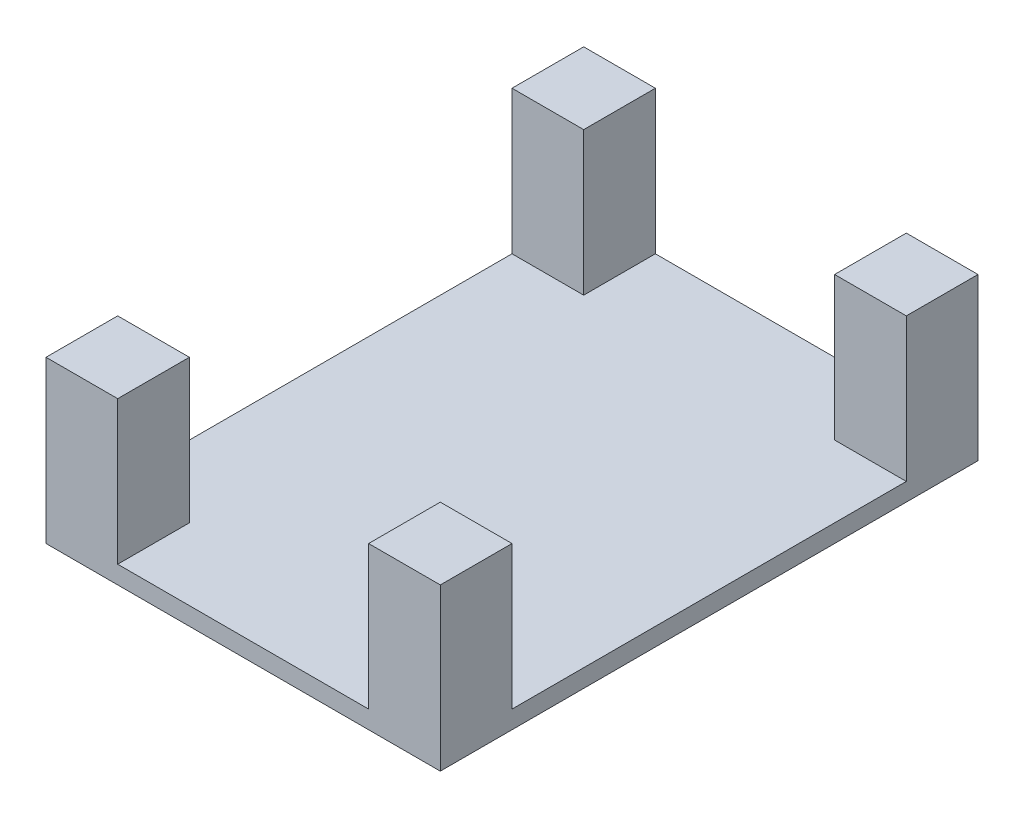
ISO-10303-21;
HEADER;
FILE_DESCRIPTION(('STEP AP214'),'2;1');
FILE_NAME('part.step','',(''),(''),'','','');
FILE_SCHEMA(('AUTOMOTIVE_DESIGN { 1 0 10303 214 1 1 1 1 }'));
ENDSEC;
DATA;
#1=APPLICATION_CONTEXT('core data for automotive mechanical design processes');
#2=APPLICATION_PROTOCOL_DEFINITION('international standard','automotive_design',2000,#1);
#3=PRODUCT_CONTEXT('',#1,'mechanical');
#4=PRODUCT('Part','Part','',(#3));
#5=PRODUCT_RELATED_PRODUCT_CATEGORY('part','',(#4));
#6=PRODUCT_DEFINITION_FORMATION('','',#4);
#7=PRODUCT_DEFINITION_CONTEXT('part definition',#1,'design');
#8=PRODUCT_DEFINITION('design','',#6,#7);
#9=PRODUCT_DEFINITION_SHAPE('','',#8);
#10=(LENGTH_UNIT() NAMED_UNIT(*) SI_UNIT(.MILLI.,.METRE.));
#11=(NAMED_UNIT(*) PLANE_ANGLE_UNIT() SI_UNIT($,.RADIAN.));
#12=(NAMED_UNIT(*) SI_UNIT($,.STERADIAN.) SOLID_ANGLE_UNIT());
#13=UNCERTAINTY_MEASURE_WITH_UNIT(LENGTH_MEASURE(1.E-05),#10,'distance_accuracy_value','');
#14=(GEOMETRIC_REPRESENTATION_CONTEXT(3) GLOBAL_UNCERTAINTY_ASSIGNED_CONTEXT((#13)) GLOBAL_UNIT_ASSIGNED_CONTEXT((#10,
#11,#12)) REPRESENTATION_CONTEXT('',''));
#15=CARTESIAN_POINT('',(0.,0.,0.));
#16=DIRECTION('',(0.,0.,1.));
#17=DIRECTION('',(1.,0.,0.));
#18=AXIS2_PLACEMENT_3D('',#15,#16,#17);
#19=CARTESIAN_POINT('',(0.,5.,0.));
#20=DIRECTION('',(0.,-1.,0.));
#21=DIRECTION('',(0.,0.,-1.));
#22=AXIS2_PLACEMENT_3D('',#19,#20,#21);
#23=PLANE('',#22);
#24=DIRECTION('',(0.,0.,1.));
#25=VECTOR('',#24,1.);
#26=CARTESIAN_POINT('',(90.,5.,-150.));
#27=LINE('',#26,#25);
#28=CARTESIAN_POINT('',(90.,5.,-150.));
#29=VERTEX_POINT('',#28);
#30=CARTESIAN_POINT('',(90.,5.,-130.));
#31=VERTEX_POINT('',#30);
#32=EDGE_CURVE('E162',#29,#31,#27,.T.);
#33=ORIENTED_EDGE('',*,*,#32,.F.);
#34=DIRECTION('',(-1.,0.,0.));
#35=VECTOR('',#34,1.);
#36=CARTESIAN_POINT('',(0.,5.,-150.));
#37=LINE('',#36,#35);
#38=CARTESIAN_POINT('',(20.,5.,-150.));
#39=VERTEX_POINT('',#38);
#40=EDGE_CURVE('E151',#29,#39,#37,.T.);
#41=ORIENTED_EDGE('',*,*,#40,.T.);
#42=DIRECTION('',(0.,0.,-1.));
#43=VECTOR('',#42,1.);
#44=CARTESIAN_POINT('',(20.,5.,-150.));
#45=LINE('',#44,#43);
#46=CARTESIAN_POINT('',(20.,5.,-130.));
#47=VERTEX_POINT('',#46);
#48=EDGE_CURVE('E241',#47,#39,#45,.T.);
#49=ORIENTED_EDGE('',*,*,#48,.F.);
#50=DIRECTION('',(1.,0.,0.));
#51=VECTOR('',#50,1.);
#52=CARTESIAN_POINT('',(0.,5.,-130.));
#53=LINE('',#52,#51);
#54=CARTESIAN_POINT('',(0.,5.,-130.));
#55=VERTEX_POINT('',#54);
#56=EDGE_CURVE('E228',#55,#47,#53,.T.);
#57=ORIENTED_EDGE('',*,*,#56,.F.);
#58=DIRECTION('',(0.,0.,1.));
#59=VECTOR('',#58,1.);
#60=CARTESIAN_POINT('',(0.,5.,0.));
#61=LINE('',#60,#59);
#62=CARTESIAN_POINT('',(0.,5.,-20.));
#63=VERTEX_POINT('',#62);
#64=EDGE_CURVE('E259',#55,#63,#61,.T.);
#65=ORIENTED_EDGE('',*,*,#64,.T.);
#66=DIRECTION('',(-1.,0.,0.));
#67=VECTOR('',#66,1.);
#68=CARTESIAN_POINT('',(0.,5.,-20.));
#69=LINE('',#68,#67);
#70=CARTESIAN_POINT('',(20.,5.,-20.));
#71=VERTEX_POINT('',#70);
#72=EDGE_CURVE('E221',#71,#63,#69,.T.);
#73=ORIENTED_EDGE('',*,*,#72,.F.);
#74=DIRECTION('',(0.,0.,-1.));
#75=VECTOR('',#74,1.);
#76=CARTESIAN_POINT('',(20.,5.,0.));
#77=LINE('',#76,#75);
#78=CARTESIAN_POINT('',(20.,5.,0.));
#79=VERTEX_POINT('',#78);
#80=EDGE_CURVE('E224',#79,#71,#77,.T.);
#81=ORIENTED_EDGE('',*,*,#80,.F.);
#82=DIRECTION('',(1.,0.,0.));
#83=VECTOR('',#82,1.);
#84=CARTESIAN_POINT('',(0.,5.,0.));
#85=LINE('',#84,#83);
#86=CARTESIAN_POINT('',(90.,5.,0.));
#87=VERTEX_POINT('',#86);
#88=EDGE_CURVE('E261',#79,#87,#85,.T.);
#89=ORIENTED_EDGE('',*,*,#88,.T.);
#90=DIRECTION('',(0.,0.,1.));
#91=VECTOR('',#90,1.);
#92=CARTESIAN_POINT('',(90.,5.,0.));
#93=LINE('',#92,#91);
#94=CARTESIAN_POINT('',(90.,5.,-20.));
#95=VERTEX_POINT('',#94);
#96=EDGE_CURVE('E196',#95,#87,#93,.T.);
#97=ORIENTED_EDGE('',*,*,#96,.F.);
#98=DIRECTION('',(-1.,0.,0.));
#99=VECTOR('',#98,1.);
#100=CARTESIAN_POINT('',(110.,5.,-20.));
#101=LINE('',#100,#99);
#102=CARTESIAN_POINT('',(110.,5.,-20.));
#103=VERTEX_POINT('',#102);
#104=EDGE_CURVE('E199',#103,#95,#101,.T.);
#105=ORIENTED_EDGE('',*,*,#104,.F.);
#106=DIRECTION('',(0.,0.,-1.));
#107=VECTOR('',#106,1.);
#108=CARTESIAN_POINT('',(110.,5.,0.));
#109=LINE('',#108,#107);
#110=CARTESIAN_POINT('',(110.,5.,-130.));
#111=VERTEX_POINT('',#110);
#112=EDGE_CURVE('E59',#103,#111,#109,.T.);
#113=ORIENTED_EDGE('',*,*,#112,.T.);
#114=DIRECTION('',(1.,0.,0.));
#115=VECTOR('',#114,1.);
#116=CARTESIAN_POINT('',(110.,5.,-130.));
#117=LINE('',#116,#115);
#118=EDGE_CURVE('E54',#31,#111,#117,.T.);
#119=ORIENTED_EDGE('',*,*,#118,.F.);
#120=EDGE_LOOP('',(#33,#41,#49,#57,#65,#73,#81,#89,#97,#105,#113,#119));
#121=FACE_BOUND('',#120,.T.);
#122=ADVANCED_FACE('F39',(#121),#23,.F.);
#123=CARTESIAN_POINT('',(0.,5.,0.));
#124=DIRECTION('',(1.,0.,0.));
#125=DIRECTION('',(0.,0.,-1.));
#126=AXIS2_PLACEMENT_3D('',#123,#124,#125);
#127=PLANE('',#126);
#128=DIRECTION('',(0.,0.,1.));
#129=VECTOR('',#128,1.);
#130=CARTESIAN_POINT('',(0.,0.,0.));
#131=LINE('',#130,#129);
#132=CARTESIAN_POINT('',(0.,0.,-150.));
#133=VERTEX_POINT('',#132);
#134=CARTESIAN_POINT('',(0.,0.,0.));
#135=VERTEX_POINT('',#134);
#136=EDGE_CURVE('E258',#133,#135,#131,.T.);
#137=ORIENTED_EDGE('',*,*,#136,.T.);
#138=DIRECTION('',(0.,-1.,0.));
#139=VECTOR('',#138,1.);
#140=CARTESIAN_POINT('',(0.,5.,0.));
#141=LINE('',#140,#139);
#142=CARTESIAN_POINT('',(0.,45.,0.));
#143=VERTEX_POINT('',#142);
#144=EDGE_CURVE('E11',#143,#135,#141,.T.);
#145=ORIENTED_EDGE('',*,*,#144,.F.);
#146=DIRECTION('',(0.,0.,1.));
#147=VECTOR('',#146,1.);
#148=CARTESIAN_POINT('',(0.,45.,0.));
#149=LINE('',#148,#147);
#150=CARTESIAN_POINT('',(0.,45.,-20.));
#151=VERTEX_POINT('',#150);
#152=EDGE_CURVE('E220',#151,#143,#149,.T.);
#153=ORIENTED_EDGE('',*,*,#152,.F.);
#154=DIRECTION('',(0.,-1.,0.));
#155=VECTOR('',#154,1.);
#156=CARTESIAN_POINT('',(0.,45.,-20.));
#157=LINE('',#156,#155);
#158=EDGE_CURVE('E217',#151,#63,#157,.T.);
#159=ORIENTED_EDGE('',*,*,#158,.T.);
#160=ORIENTED_EDGE('',*,*,#64,.F.);
#161=DIRECTION('',(0.,-1.,0.));
#162=VECTOR('',#161,1.);
#163=CARTESIAN_POINT('',(0.,45.,-130.));
#164=LINE('',#163,#162);
#165=CARTESIAN_POINT('',(0.,45.,-130.));
#166=VERTEX_POINT('',#165);
#167=EDGE_CURVE('E255',#166,#55,#164,.T.);
#168=ORIENTED_EDGE('',*,*,#167,.F.);
#169=DIRECTION('',(0.,0.,1.));
#170=VECTOR('',#169,1.);
#171=CARTESIAN_POINT('',(0.,45.,-150.));
#172=LINE('',#171,#170);
#173=CARTESIAN_POINT('',(0.,45.,-150.));
#174=VERTEX_POINT('',#173);
#175=EDGE_CURVE('E237',#174,#166,#172,.T.);
#176=ORIENTED_EDGE('',*,*,#175,.F.);
#177=DIRECTION('',(0.,-1.,0.));
#178=VECTOR('',#177,1.);
#179=CARTESIAN_POINT('',(0.,5.,-150.));
#180=LINE('',#179,#178);
#181=EDGE_CURVE('E160',#174,#133,#180,.T.);
#182=ORIENTED_EDGE('',*,*,#181,.T.);
#183=EDGE_LOOP('',(#137,#145,#153,#159,#160,#168,#176,#182));
#184=FACE_BOUND('',#183,.T.);
#185=ADVANCED_FACE('F41',(#184),#127,.F.);
#186=CARTESIAN_POINT('',(0.,5.,0.));
#187=DIRECTION('',(0.,0.,-1.));
#188=DIRECTION('',(-1.,0.,0.));
#189=AXIS2_PLACEMENT_3D('',#186,#187,#188);
#190=PLANE('',#189);
#191=DIRECTION('',(1.,0.,0.));
#192=VECTOR('',#191,1.);
#193=CARTESIAN_POINT('',(0.,0.,0.));
#194=LINE('',#193,#192);
#195=CARTESIAN_POINT('',(110.,0.,0.));
#196=VERTEX_POINT('',#195);
#197=EDGE_CURVE('E267',#135,#196,#194,.T.);
#198=ORIENTED_EDGE('',*,*,#197,.T.);
#199=DIRECTION('',(0.,-1.,0.));
#200=VECTOR('',#199,1.);
#201=CARTESIAN_POINT('',(110.,5.,0.));
#202=LINE('',#201,#200);
#203=CARTESIAN_POINT('',(110.,45.,0.));
#204=VERTEX_POINT('',#203);
#205=EDGE_CURVE('E47',#204,#196,#202,.T.);
#206=ORIENTED_EDGE('',*,*,#205,.F.);
#207=DIRECTION('',(1.,0.,0.));
#208=VECTOR('',#207,1.);
#209=CARTESIAN_POINT('',(110.,45.,0.));
#210=LINE('',#209,#208);
#211=CARTESIAN_POINT('',(90.,45.,0.));
#212=VERTEX_POINT('',#211);
#213=EDGE_CURVE('E195',#212,#204,#210,.T.);
#214=ORIENTED_EDGE('',*,*,#213,.F.);
#215=DIRECTION('',(0.,-1.,0.));
#216=VECTOR('',#215,1.);
#217=CARTESIAN_POINT('',(90.,45.,0.));
#218=LINE('',#217,#216);
#219=EDGE_CURVE('E192',#212,#87,#218,.T.);
#220=ORIENTED_EDGE('',*,*,#219,.T.);
#221=ORIENTED_EDGE('',*,*,#88,.F.);
#222=DIRECTION('',(0.,-1.,0.));
#223=VECTOR('',#222,1.);
#224=CARTESIAN_POINT('',(20.,45.,0.));
#225=LINE('',#224,#223);
#226=CARTESIAN_POINT('',(20.,45.,0.));
#227=VERTEX_POINT('',#226);
#228=EDGE_CURVE('E203',#227,#79,#225,.T.);
#229=ORIENTED_EDGE('',*,*,#228,.F.);
#230=DIRECTION('',(1.,0.,0.));
#231=VECTOR('',#230,1.);
#232=CARTESIAN_POINT('',(0.,45.,0.));
#233=LINE('',#232,#231);
#234=EDGE_CURVE('E225',#143,#227,#233,.T.);
#235=ORIENTED_EDGE('',*,*,#234,.F.);
#236=ORIENTED_EDGE('',*,*,#144,.T.);
#237=EDGE_LOOP('',(#198,#206,#214,#220,#221,#229,#235,#236));
#238=FACE_BOUND('',#237,.T.);
#239=ADVANCED_FACE('F313',(#238),#190,.F.);
#240=CARTESIAN_POINT('',(110.,5.,0.));
#241=DIRECTION('',(-1.,0.,0.));
#242=DIRECTION('',(0.,0.,1.));
#243=AXIS2_PLACEMENT_3D('',#240,#241,#242);
#244=PLANE('',#243);
#245=DIRECTION('',(0.,0.,-1.));
#246=VECTOR('',#245,1.);
#247=CARTESIAN_POINT('',(110.,0.,0.));
#248=LINE('',#247,#246);
#249=CARTESIAN_POINT('',(110.,0.,-150.));
#250=VERTEX_POINT('',#249);
#251=EDGE_CURVE('E269',#196,#250,#248,.T.);
#252=ORIENTED_EDGE('',*,*,#251,.T.);
#253=DIRECTION('',(0.,-1.,0.));
#254=VECTOR('',#253,1.);
#255=CARTESIAN_POINT('',(110.,5.,-150.));
#256=LINE('',#255,#254);
#257=CARTESIAN_POINT('',(110.,45.,-150.));
#258=VERTEX_POINT('',#257);
#259=EDGE_CURVE('E274',#258,#250,#256,.T.);
#260=ORIENTED_EDGE('',*,*,#259,.F.);
#261=DIRECTION('',(0.,0.,-1.));
#262=VECTOR('',#261,1.);
#263=CARTESIAN_POINT('',(110.,45.,-150.));
#264=LINE('',#263,#262);
#265=CARTESIAN_POINT('',(110.,45.,-130.));
#266=VERTEX_POINT('',#265);
#267=EDGE_CURVE('E178',#266,#258,#264,.T.);
#268=ORIENTED_EDGE('',*,*,#267,.F.);
#269=DIRECTION('',(0.,-1.,0.));
#270=VECTOR('',#269,1.);
#271=CARTESIAN_POINT('',(110.,45.,-130.));
#272=LINE('',#271,#270);
#273=EDGE_CURVE('E173',#266,#111,#272,.T.);
#274=ORIENTED_EDGE('',*,*,#273,.T.);
#275=ORIENTED_EDGE('',*,*,#112,.F.);
#276=DIRECTION('',(0.,-1.,0.));
#277=VECTOR('',#276,1.);
#278=CARTESIAN_POINT('',(110.,45.,-20.));
#279=LINE('',#278,#277);
#280=CARTESIAN_POINT('',(110.,45.,-20.));
#281=VERTEX_POINT('',#280);
#282=EDGE_CURVE('E166',#281,#103,#279,.T.);
#283=ORIENTED_EDGE('',*,*,#282,.F.);
#284=DIRECTION('',(0.,0.,-1.));
#285=VECTOR('',#284,1.);
#286=CARTESIAN_POINT('',(110.,45.,0.));
#287=LINE('',#286,#285);
#288=EDGE_CURVE('E200',#204,#281,#287,.T.);
#289=ORIENTED_EDGE('',*,*,#288,.F.);
#290=ORIENTED_EDGE('',*,*,#205,.T.);
#291=EDGE_LOOP('',(#252,#260,#268,#274,#275,#283,#289,#290));
#292=FACE_BOUND('',#291,.T.);
#293=ADVANCED_FACE('F280',(#292),#244,.F.);
#294=CARTESIAN_POINT('',(0.,5.,-150.));
#295=DIRECTION('',(0.,0.,1.));
#296=DIRECTION('',(1.,0.,0.));
#297=AXIS2_PLACEMENT_3D('',#294,#295,#296);
#298=PLANE('',#297);
#299=DIRECTION('',(-1.,0.,0.));
#300=VECTOR('',#299,1.);
#301=CARTESIAN_POINT('',(0.,0.,-150.));
#302=LINE('',#301,#300);
#303=EDGE_CURVE('E262',#250,#133,#302,.T.);
#304=ORIENTED_EDGE('',*,*,#303,.T.);
#305=ORIENTED_EDGE('',*,*,#181,.F.);
#306=DIRECTION('',(-1.,0.,0.));
#307=VECTOR('',#306,1.);
#308=CARTESIAN_POINT('',(0.,45.,-150.));
#309=LINE('',#308,#307);
#310=CARTESIAN_POINT('',(20.,45.,-150.));
#311=VERTEX_POINT('',#310);
#312=EDGE_CURVE('E245',#311,#174,#309,.T.);
#313=ORIENTED_EDGE('',*,*,#312,.F.);
#314=DIRECTION('',(0.,-1.,0.));
#315=VECTOR('',#314,1.);
#316=CARTESIAN_POINT('',(20.,45.,-150.));
#317=LINE('',#316,#315);
#318=EDGE_CURVE('E158',#311,#39,#317,.T.);
#319=ORIENTED_EDGE('',*,*,#318,.T.);
#320=ORIENTED_EDGE('',*,*,#40,.F.);
#321=DIRECTION('',(0.,-1.,0.));
#322=VECTOR('',#321,1.);
#323=CARTESIAN_POINT('',(90.,45.,-150.));
#324=LINE('',#323,#322);
#325=CARTESIAN_POINT('',(90.,45.,-150.));
#326=VERTEX_POINT('',#325);
#327=EDGE_CURVE('E155',#326,#29,#324,.T.);
#328=ORIENTED_EDGE('',*,*,#327,.F.);
#329=DIRECTION('',(-1.,0.,0.));
#330=VECTOR('',#329,1.);
#331=CARTESIAN_POINT('',(110.,45.,-150.));
#332=LINE('',#331,#330);
#333=EDGE_CURVE('E179',#258,#326,#332,.T.);
#334=ORIENTED_EDGE('',*,*,#333,.F.);
#335=ORIENTED_EDGE('',*,*,#259,.T.);
#336=EDGE_LOOP('',(#304,#305,#313,#319,#320,#328,#334,#335));
#337=FACE_BOUND('',#336,.T.);
#338=ADVANCED_FACE('F152',(#337),#298,.F.);
#339=CARTESIAN_POINT('',(0.,0.,0.));
#340=DIRECTION('',(0.,-1.,0.));
#341=DIRECTION('',(0.,0.,-1.));
#342=AXIS2_PLACEMENT_3D('',#339,#340,#341);
#343=PLANE('',#342);
#344=ORIENTED_EDGE('',*,*,#136,.F.);
#345=ORIENTED_EDGE('',*,*,#303,.F.);
#346=ORIENTED_EDGE('',*,*,#251,.F.);
#347=ORIENTED_EDGE('',*,*,#197,.F.);
#348=EDGE_LOOP('',(#344,#345,#346,#347));
#349=FACE_BOUND('',#348,.T.);
#350=ADVANCED_FACE('F287',(#349),#343,.T.);
#351=CARTESIAN_POINT('',(0.,45.,-130.));
#352=DIRECTION('',(0.,0.,-1.));
#353=DIRECTION('',(-1.,0.,0.));
#354=AXIS2_PLACEMENT_3D('',#351,#352,#353);
#355=PLANE('',#354);
#356=ORIENTED_EDGE('',*,*,#56,.T.);
#357=DIRECTION('',(0.,-1.,0.));
#358=VECTOR('',#357,1.);
#359=CARTESIAN_POINT('',(20.,45.,-130.));
#360=LINE('',#359,#358);
#361=CARTESIAN_POINT('',(20.,45.,-130.));
#362=VERTEX_POINT('',#361);
#363=EDGE_CURVE('E252',#362,#47,#360,.T.);
#364=ORIENTED_EDGE('',*,*,#363,.F.);
#365=DIRECTION('',(1.,0.,0.));
#366=VECTOR('',#365,1.);
#367=CARTESIAN_POINT('',(0.,45.,-130.));
#368=LINE('',#367,#366);
#369=EDGE_CURVE('E240',#166,#362,#368,.T.);
#370=ORIENTED_EDGE('',*,*,#369,.F.);
#371=ORIENTED_EDGE('',*,*,#167,.T.);
#372=EDGE_LOOP('',(#356,#364,#370,#371));
#373=FACE_BOUND('',#372,.T.);
#374=ADVANCED_FACE('F299',(#373),#355,.F.);
#375=CARTESIAN_POINT('',(20.,45.,-150.));
#376=DIRECTION('',(-1.,0.,0.));
#377=DIRECTION('',(0.,0.,1.));
#378=AXIS2_PLACEMENT_3D('',#375,#376,#377);
#379=PLANE('',#378);
#380=ORIENTED_EDGE('',*,*,#48,.T.);
#381=ORIENTED_EDGE('',*,*,#318,.F.);
#382=DIRECTION('',(0.,0.,-1.));
#383=VECTOR('',#382,1.);
#384=CARTESIAN_POINT('',(20.,45.,-150.));
#385=LINE('',#384,#383);
#386=EDGE_CURVE('E243',#362,#311,#385,.T.);
#387=ORIENTED_EDGE('',*,*,#386,.F.);
#388=ORIENTED_EDGE('',*,*,#363,.T.);
#389=EDGE_LOOP('',(#380,#381,#387,#388));
#390=FACE_BOUND('',#389,.T.);
#391=ADVANCED_FACE('F297',(#390),#379,.F.);
#392=CARTESIAN_POINT('',(0.,45.,0.));
#393=DIRECTION('',(0.,1.,0.));
#394=DIRECTION('',(0.,0.,1.));
#395=AXIS2_PLACEMENT_3D('',#392,#393,#394);
#396=PLANE('',#395);
#397=ORIENTED_EDGE('',*,*,#175,.T.);
#398=ORIENTED_EDGE('',*,*,#369,.T.);
#399=ORIENTED_EDGE('',*,*,#386,.T.);
#400=ORIENTED_EDGE('',*,*,#312,.T.);
#401=EDGE_LOOP('',(#397,#398,#399,#400));
#402=FACE_BOUND('',#401,.T.);
#403=ADVANCED_FACE('F293',(#402),#396,.T.);
#404=CARTESIAN_POINT('',(20.,45.,0.));
#405=DIRECTION('',(-1.,0.,0.));
#406=DIRECTION('',(0.,0.,1.));
#407=AXIS2_PLACEMENT_3D('',#404,#405,#406);
#408=PLANE('',#407);
#409=ORIENTED_EDGE('',*,*,#80,.T.);
#410=DIRECTION('',(0.,-1.,0.));
#411=VECTOR('',#410,1.);
#412=CARTESIAN_POINT('',(20.,45.,-20.));
#413=LINE('',#412,#411);
#414=CARTESIAN_POINT('',(20.,45.,-20.));
#415=VERTEX_POINT('',#414);
#416=EDGE_CURVE('E214',#415,#71,#413,.T.);
#417=ORIENTED_EDGE('',*,*,#416,.F.);
#418=DIRECTION('',(0.,0.,-1.));
#419=VECTOR('',#418,1.);
#420=CARTESIAN_POINT('',(20.,45.,0.));
#421=LINE('',#420,#419);
#422=EDGE_CURVE('E233',#227,#415,#421,.T.);
#423=ORIENTED_EDGE('',*,*,#422,.F.);
#424=ORIENTED_EDGE('',*,*,#228,.T.);
#425=EDGE_LOOP('',(#409,#417,#423,#424));
#426=FACE_BOUND('',#425,.T.);
#427=ADVANCED_FACE('F333',(#426),#408,.F.);
#428=CARTESIAN_POINT('',(0.,45.,-20.));
#429=DIRECTION('',(0.,0.,1.));
#430=DIRECTION('',(1.,0.,0.));
#431=AXIS2_PLACEMENT_3D('',#428,#429,#430);
#432=PLANE('',#431);
#433=ORIENTED_EDGE('',*,*,#72,.T.);
#434=ORIENTED_EDGE('',*,*,#158,.F.);
#435=DIRECTION('',(-1.,0.,0.));
#436=VECTOR('',#435,1.);
#437=CARTESIAN_POINT('',(0.,45.,-20.));
#438=LINE('',#437,#436);
#439=EDGE_CURVE('E231',#415,#151,#438,.T.);
#440=ORIENTED_EDGE('',*,*,#439,.F.);
#441=ORIENTED_EDGE('',*,*,#416,.T.);
#442=EDGE_LOOP('',(#433,#434,#440,#441));
#443=FACE_BOUND('',#442,.T.);
#444=ADVANCED_FACE('F330',(#443),#432,.F.);
#445=CARTESIAN_POINT('',(0.,45.,0.));
#446=DIRECTION('',(0.,1.,0.));
#447=DIRECTION('',(0.,0.,1.));
#448=AXIS2_PLACEMENT_3D('',#445,#446,#447);
#449=PLANE('',#448);
#450=ORIENTED_EDGE('',*,*,#234,.T.);
#451=ORIENTED_EDGE('',*,*,#422,.T.);
#452=ORIENTED_EDGE('',*,*,#439,.T.);
#453=ORIENTED_EDGE('',*,*,#152,.T.);
#454=EDGE_LOOP('',(#450,#451,#452,#453));
#455=FACE_BOUND('',#454,.T.);
#456=ADVANCED_FACE('F325',(#455),#449,.T.);
#457=CARTESIAN_POINT('',(110.,45.,-20.));
#458=DIRECTION('',(0.,0.,1.));
#459=DIRECTION('',(1.,0.,0.));
#460=AXIS2_PLACEMENT_3D('',#457,#458,#459);
#461=PLANE('',#460);
#462=ORIENTED_EDGE('',*,*,#104,.T.);
#463=DIRECTION('',(0.,-1.,0.));
#464=VECTOR('',#463,1.);
#465=CARTESIAN_POINT('',(90.,45.,-20.));
#466=LINE('',#465,#464);
#467=CARTESIAN_POINT('',(90.,45.,-20.));
#468=VERTEX_POINT('',#467);
#469=EDGE_CURVE('E189',#468,#95,#466,.T.);
#470=ORIENTED_EDGE('',*,*,#469,.F.);
#471=DIRECTION('',(-1.,0.,0.));
#472=VECTOR('',#471,1.);
#473=CARTESIAN_POINT('',(110.,45.,-20.));
#474=LINE('',#473,#472);
#475=EDGE_CURVE('E208',#281,#468,#474,.T.);
#476=ORIENTED_EDGE('',*,*,#475,.F.);
#477=ORIENTED_EDGE('',*,*,#282,.T.);
#478=EDGE_LOOP('',(#462,#470,#476,#477));
#479=FACE_BOUND('',#478,.T.);
#480=ADVANCED_FACE('F340',(#479),#461,.F.);
#481=CARTESIAN_POINT('',(90.,45.,0.));
#482=DIRECTION('',(1.,0.,0.));
#483=DIRECTION('',(0.,0.,-1.));
#484=AXIS2_PLACEMENT_3D('',#481,#482,#483);
#485=PLANE('',#484);
#486=ORIENTED_EDGE('',*,*,#96,.T.);
#487=ORIENTED_EDGE('',*,*,#219,.F.);
#488=DIRECTION('',(0.,0.,1.));
#489=VECTOR('',#488,1.);
#490=CARTESIAN_POINT('',(90.,45.,0.));
#491=LINE('',#490,#489);
#492=EDGE_CURVE('E206',#468,#212,#491,.T.);
#493=ORIENTED_EDGE('',*,*,#492,.F.);
#494=ORIENTED_EDGE('',*,*,#469,.T.);
#495=EDGE_LOOP('',(#486,#487,#493,#494));
#496=FACE_BOUND('',#495,.T.);
#497=ADVANCED_FACE('F336',(#496),#485,.F.);
#498=CARTESIAN_POINT('',(0.,45.,0.));
#499=DIRECTION('',(0.,1.,0.));
#500=DIRECTION('',(0.,0.,1.));
#501=AXIS2_PLACEMENT_3D('',#498,#499,#500);
#502=PLANE('',#501);
#503=ORIENTED_EDGE('',*,*,#288,.T.);
#504=ORIENTED_EDGE('',*,*,#475,.T.);
#505=ORIENTED_EDGE('',*,*,#492,.T.);
#506=ORIENTED_EDGE('',*,*,#213,.T.);
#507=EDGE_LOOP('',(#503,#504,#505,#506));
#508=FACE_BOUND('',#507,.T.);
#509=ADVANCED_FACE('F360',(#508),#502,.T.);
#510=CARTESIAN_POINT('',(90.,45.,-150.));
#511=DIRECTION('',(1.,0.,0.));
#512=DIRECTION('',(0.,0.,-1.));
#513=AXIS2_PLACEMENT_3D('',#510,#511,#512);
#514=PLANE('',#513);
#515=ORIENTED_EDGE('',*,*,#32,.T.);
#516=DIRECTION('',(0.,-1.,0.));
#517=VECTOR('',#516,1.);
#518=CARTESIAN_POINT('',(90.,45.,-130.));
#519=LINE('',#518,#517);
#520=CARTESIAN_POINT('',(90.,45.,-130.));
#521=VERTEX_POINT('',#520);
#522=EDGE_CURVE('E171',#521,#31,#519,.T.);
#523=ORIENTED_EDGE('',*,*,#522,.F.);
#524=DIRECTION('',(0.,0.,1.));
#525=VECTOR('',#524,1.);
#526=CARTESIAN_POINT('',(90.,45.,-150.));
#527=LINE('',#526,#525);
#528=EDGE_CURVE('E169',#326,#521,#527,.T.);
#529=ORIENTED_EDGE('',*,*,#528,.F.);
#530=ORIENTED_EDGE('',*,*,#327,.T.);
#531=EDGE_LOOP('',(#515,#523,#529,#530));
#532=FACE_BOUND('',#531,.T.);
#533=ADVANCED_FACE('F168',(#532),#514,.F.);
#534=CARTESIAN_POINT('',(110.,45.,-130.));
#535=DIRECTION('',(0.,0.,-1.));
#536=DIRECTION('',(-1.,0.,0.));
#537=AXIS2_PLACEMENT_3D('',#534,#535,#536);
#538=PLANE('',#537);
#539=ORIENTED_EDGE('',*,*,#118,.T.);
#540=ORIENTED_EDGE('',*,*,#273,.F.);
#541=DIRECTION('',(1.,0.,0.));
#542=VECTOR('',#541,1.);
#543=CARTESIAN_POINT('',(110.,45.,-130.));
#544=LINE('',#543,#542);
#545=EDGE_CURVE('E183',#521,#266,#544,.T.);
#546=ORIENTED_EDGE('',*,*,#545,.F.);
#547=ORIENTED_EDGE('',*,*,#522,.T.);
#548=EDGE_LOOP('',(#539,#540,#546,#547));
#549=FACE_BOUND('',#548,.T.);
#550=ADVANCED_FACE('F345',(#549),#538,.F.);
#551=CARTESIAN_POINT('',(0.,45.,0.));
#552=DIRECTION('',(0.,1.,0.));
#553=DIRECTION('',(0.,0.,1.));
#554=AXIS2_PLACEMENT_3D('',#551,#552,#553);
#555=PLANE('',#554);
#556=ORIENTED_EDGE('',*,*,#333,.T.);
#557=ORIENTED_EDGE('',*,*,#528,.T.);
#558=ORIENTED_EDGE('',*,*,#545,.T.);
#559=ORIENTED_EDGE('',*,*,#267,.T.);
#560=EDGE_LOOP('',(#556,#557,#558,#559));
#561=FACE_BOUND('',#560,.T.);
#562=ADVANCED_FACE('F347',(#561),#555,.T.);
#563=CLOSED_SHELL('',(#122,#185,#239,#293,#338,#350,#374,#391,#403,#427,#444,#456,#480,#497,
#509,#533,#550,#562));
#564=MANIFOLD_SOLID_BREP('B2',#563);
#565=ADVANCED_BREP_SHAPE_REPRESENTATION('',(#18,#564),#14);
#566=SHAPE_DEFINITION_REPRESENTATION(#9,#565);
ENDSEC;
END-ISO-10303-21;
